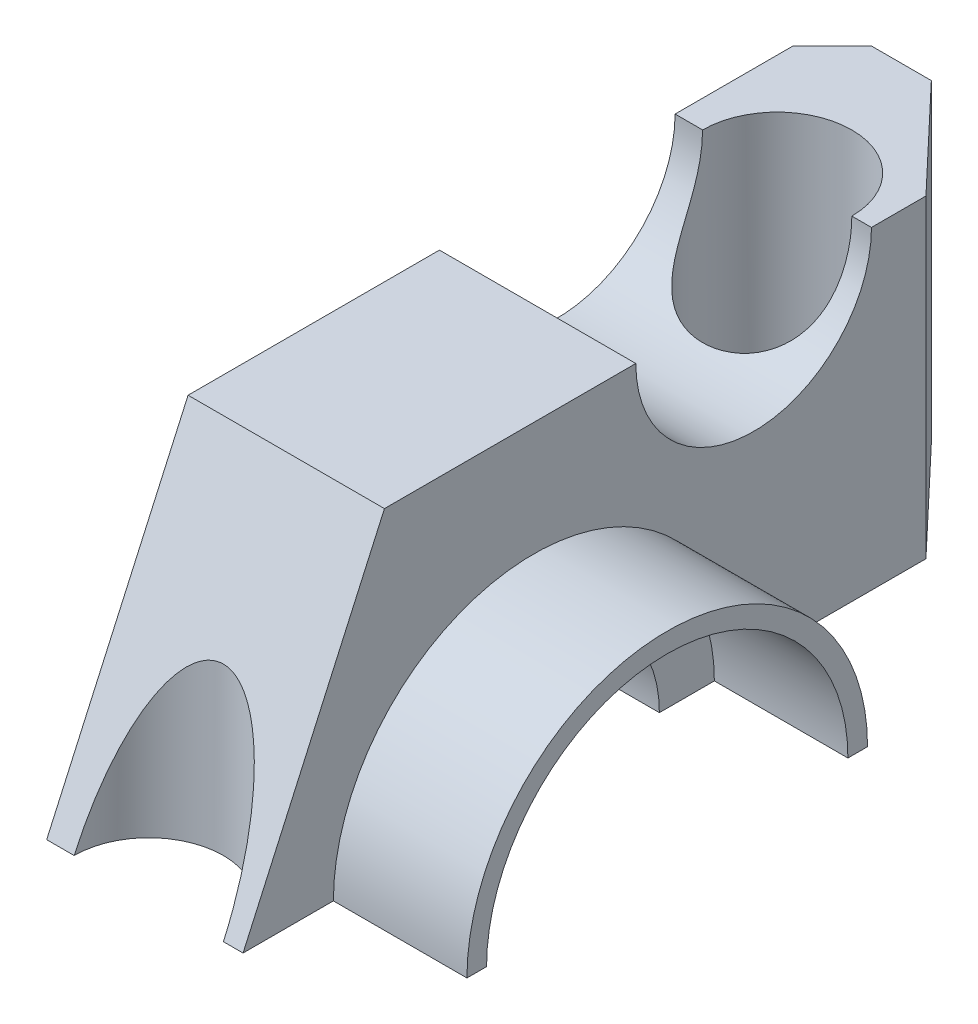
ISO-10303-21;
HEADER;
FILE_DESCRIPTION(('STEP AP214'),'2;1');
FILE_NAME('part.step','',(''),(''),'','','');
FILE_SCHEMA(('AUTOMOTIVE_DESIGN { 1 0 10303 214 1 1 1 1 }'));
ENDSEC;
DATA;
#1=APPLICATION_CONTEXT('core data for automotive mechanical design processes');
#2=APPLICATION_PROTOCOL_DEFINITION('international standard','automotive_design',2000,#1);
#3=PRODUCT_CONTEXT('',#1,'mechanical');
#4=PRODUCT('Part','Part','',(#3));
#5=PRODUCT_RELATED_PRODUCT_CATEGORY('part','',(#4));
#6=PRODUCT_DEFINITION_FORMATION('','',#4);
#7=PRODUCT_DEFINITION_CONTEXT('part definition',#1,'design');
#8=PRODUCT_DEFINITION('design','',#6,#7);
#9=PRODUCT_DEFINITION_SHAPE('','',#8);
#10=(LENGTH_UNIT() NAMED_UNIT(*) SI_UNIT(.MILLI.,.METRE.));
#11=(NAMED_UNIT(*) PLANE_ANGLE_UNIT() SI_UNIT($,.RADIAN.));
#12=(NAMED_UNIT(*) SI_UNIT($,.STERADIAN.) SOLID_ANGLE_UNIT());
#13=UNCERTAINTY_MEASURE_WITH_UNIT(LENGTH_MEASURE(1.E-05),#10,'distance_accuracy_value','');
#14=(GEOMETRIC_REPRESENTATION_CONTEXT(3) GLOBAL_UNCERTAINTY_ASSIGNED_CONTEXT((#13)) GLOBAL_UNIT_ASSIGNED_CONTEXT((#10,
#11,#12)) REPRESENTATION_CONTEXT('',''));
#15=CARTESIAN_POINT('',(0.,0.,0.));
#16=DIRECTION('',(0.,0.,1.));
#17=DIRECTION('',(1.,0.,0.));
#18=AXIS2_PLACEMENT_3D('',#15,#16,#17);
#19=CARTESIAN_POINT('',(25.,0.,0.));
#20=DIRECTION('',(1.,0.,0.));
#21=DIRECTION('',(0.,0.,-1.));
#22=AXIS2_PLACEMENT_3D('',#19,#20,#21);
#23=PLANE('',#22);
#24=CARTESIAN_POINT('',(25.,0.,63.));
#25=DIRECTION('',(1.,0.,0.));
#26=DIRECTION('',(0.,0.,-1.));
#27=AXIS2_PLACEMENT_3D('',#24,#25,#26);
#28=CIRCLE('',#27,25.5);
#29=CARTESIAN_POINT('',(25.,0.,37.5));
#30=VERTEX_POINT('',#29);
#31=CARTESIAN_POINT('',(25.,0.,88.5));
#32=VERTEX_POINT('',#31);
#33=EDGE_CURVE('E170',#30,#32,#28,.T.);
#34=ORIENTED_EDGE('',*,*,#33,.F.);
#35=DIRECTION('',(0.,0.,-1.));
#36=VECTOR('',#35,1.);
#37=CARTESIAN_POINT('',(25.,0.,0.));
#38=LINE('',#37,#36);
#39=CARTESIAN_POINT('',(25.,0.,13.0665833330676));
#40=VERTEX_POINT('',#39);
#41=EDGE_CURVE('E213',#30,#40,#38,.T.);
#42=ORIENTED_EDGE('',*,*,#41,.T.);
#43=DIRECTION('',(0.,1.,0.));
#44=VECTOR('',#43,1.);
#45=CARTESIAN_POINT('',(25.,0.,13.0665833330676));
#46=LINE('',#45,#44);
#47=CARTESIAN_POINT('',(25.,40.,13.0665833330676));
#48=VERTEX_POINT('',#47);
#49=EDGE_CURVE('E311',#40,#48,#46,.T.);
#50=ORIENTED_EDGE('',*,*,#49,.T.);
#51=DIRECTION('',(0.,0.,1.));
#52=VECTOR('',#51,1.);
#53=CARTESIAN_POINT('',(25.,40.,0.));
#54=LINE('',#53,#52);
#55=CARTESIAN_POINT('',(25.,40.,20.));
#56=VERTEX_POINT('',#55);
#57=EDGE_CURVE('E208',#48,#56,#54,.T.);
#58=ORIENTED_EDGE('',*,*,#57,.T.);
#59=CARTESIAN_POINT('',(25.,40.,35.));
#60=DIRECTION('',(1.,0.,0.));
#61=DIRECTION('',(0.,0.,-1.));
#62=AXIS2_PLACEMENT_3D('',#59,#60,#61);
#63=CIRCLE('',#62,15.);
#64=CARTESIAN_POINT('',(25.,40.,50.));
#65=VERTEX_POINT('',#64);
#66=EDGE_CURVE('E189',#56,#65,#63,.F.);
#67=ORIENTED_EDGE('',*,*,#66,.T.);
#68=CARTESIAN_POINT('',(25.,40.,82.));
#69=VERTEX_POINT('',#68);
#70=EDGE_CURVE('E211',#65,#69,#54,.T.);
#71=ORIENTED_EDGE('',*,*,#70,.T.);
#72=DIRECTION('',(0.,-0.911921505175107,0.410364677328798));
#73=VECTOR('',#72,1.);
#74=CARTESIAN_POINT('',(25.,0.,100.));
#75=LINE('',#74,#73);
#76=CARTESIAN_POINT('',(25.,0.,100.));
#77=VERTEX_POINT('',#76);
#78=EDGE_CURVE('E210',#69,#77,#75,.T.);
#79=ORIENTED_EDGE('',*,*,#78,.T.);
#80=EDGE_CURVE('E59',#77,#32,#38,.T.);
#81=ORIENTED_EDGE('',*,*,#80,.T.);
#82=EDGE_LOOP('',(#34,#42,#50,#58,#67,#71,#79,#81));
#83=FACE_BOUND('',#82,.T.);
#84=ADVANCED_FACE('F35',(#83),#23,.T.);
#85=CARTESIAN_POINT('',(25.,0.,63.));
#86=DIRECTION('',(-1.,0.,0.));
#87=DIRECTION('',(0.,0.,-1.));
#88=AXIS2_PLACEMENT_3D('',#85,#86,#87);
#89=CIRCLE('',#88,23.);
#90=CARTESIAN_POINT('',(25.,0.,86.));
#91=VERTEX_POINT('',#90);
#92=CARTESIAN_POINT('',(25.,0.,40.));
#93=VERTEX_POINT('',#92);
#94=EDGE_CURVE('E51',#91,#93,#89,.T.);
#95=ORIENTED_EDGE('',*,*,#94,.F.);
#96=CARTESIAN_POINT('',(25.,0.,79.));
#97=VERTEX_POINT('',#96);
#98=EDGE_CURVE('E216',#91,#97,#38,.T.);
#99=ORIENTED_EDGE('',*,*,#98,.T.);
#100=CARTESIAN_POINT('',(25.,0.,63.));
#101=DIRECTION('',(1.,0.,0.));
#102=DIRECTION('',(0.,0.,-1.));
#103=AXIS2_PLACEMENT_3D('',#100,#101,#102);
#104=CIRCLE('',#103,16.);
#105=CARTESIAN_POINT('',(25.,0.,47.));
#106=VERTEX_POINT('',#105);
#107=EDGE_CURVE('E198',#97,#106,#104,.F.);
#108=ORIENTED_EDGE('',*,*,#107,.T.);
#109=EDGE_CURVE('E217',#106,#93,#38,.T.);
#110=ORIENTED_EDGE('',*,*,#109,.T.);
#111=EDGE_LOOP('',(#95,#99,#108,#110));
#112=FACE_BOUND('',#111,.T.);
#113=ADVANCED_FACE('F279',(#112),#23,.T.);
#114=CARTESIAN_POINT('',(25.,40.,0.));
#115=DIRECTION('',(0.,-1.,0.));
#116=DIRECTION('',(0.,0.,-1.));
#117=AXIS2_PLACEMENT_3D('',#114,#115,#116);
#118=PLANE('',#117);
#119=DIRECTION('',(-1.,0.,0.));
#120=VECTOR('',#119,1.);
#121=CARTESIAN_POINT('',(25.,40.,0.));
#122=LINE('',#121,#120);
#123=CARTESIAN_POINT('',(12.62,40.,0.));
#124=VERTEX_POINT('',#123);
#125=CARTESIAN_POINT('',(4.99999999999999,40.,0.));
#126=VERTEX_POINT('',#125);
#127=EDGE_CURVE('E236',#124,#126,#122,.T.);
#128=ORIENTED_EDGE('',*,*,#127,.T.);
#129=DIRECTION('',(0.707106781186546,0.,-0.70710678118655));
#130=VECTOR('',#129,1.);
#131=CARTESIAN_POINT('',(4.99999999999999,40.,0.));
#132=LINE('',#131,#130);
#133=CARTESIAN_POINT('',(0.,40.,5.00000000000002));
#134=VERTEX_POINT('',#133);
#135=EDGE_CURVE('E310',#126,#134,#132,.F.);
#136=ORIENTED_EDGE('',*,*,#135,.T.);
#137=DIRECTION('',(0.,0.,1.));
#138=VECTOR('',#137,1.);
#139=CARTESIAN_POINT('',(0.,40.,0.));
#140=LINE('',#139,#138);
#141=CARTESIAN_POINT('',(0.,40.,20.));
#142=VERTEX_POINT('',#141);
#143=EDGE_CURVE('E218',#134,#142,#140,.T.);
#144=ORIENTED_EDGE('',*,*,#143,.T.);
#145=DIRECTION('',(-1.,0.,0.));
#146=VECTOR('',#145,1.);
#147=CARTESIAN_POINT('',(119.,40.,20.));
#148=LINE('',#147,#146);
#149=CARTESIAN_POINT('',(3.5,40.,20.));
#150=VERTEX_POINT('',#149);
#151=EDGE_CURVE('E183',#150,#142,#148,.T.);
#152=ORIENTED_EDGE('',*,*,#151,.F.);
#153=CARTESIAN_POINT('',(13.,40.,20.));
#154=DIRECTION('',(0.,-1.,0.));
#155=DIRECTION('',(0.,0.,-1.));
#156=AXIS2_PLACEMENT_3D('',#153,#154,#155);
#157=CIRCLE('',#156,9.5);
#158=CARTESIAN_POINT('',(22.5,40.,20.));
#159=VERTEX_POINT('',#158);
#160=EDGE_CURVE('E202',#159,#150,#157,.F.);
#161=ORIENTED_EDGE('',*,*,#160,.F.);
#162=EDGE_CURVE('E186',#56,#159,#148,.T.);
#163=ORIENTED_EDGE('',*,*,#162,.F.);
#164=ORIENTED_EDGE('',*,*,#57,.F.);
#165=DIRECTION('',(0.687777777777778,0.,0.725921296281533));
#166=VECTOR('',#165,1.);
#167=CARTESIAN_POINT('',(18.4762138024691,40.,6.18099399565619));
#168=LINE('',#167,#166);
#169=EDGE_CURVE('E181',#124,#48,#168,.T.);
#170=ORIENTED_EDGE('',*,*,#169,.F.);
#171=EDGE_LOOP('',(#128,#136,#144,#152,#161,#163,#164,#170));
#172=FACE_BOUND('',#171,.T.);
#173=ADVANCED_FACE('F283',(#172),#118,.F.);
#174=CARTESIAN_POINT('',(25.,0.,0.));
#175=DIRECTION('',(0.,1.,0.));
#176=DIRECTION('',(0.,0.,1.));
#177=AXIS2_PLACEMENT_3D('',#174,#175,#176);
#178=PLANE('',#177);
#179=CARTESIAN_POINT('',(13.,0.,20.));
#180=DIRECTION('',(0.,1.,0.));
#181=DIRECTION('',(0.,0.,1.));
#182=AXIS2_PLACEMENT_3D('',#179,#180,#181);
#183=CIRCLE('',#182,9.5);
#184=CARTESIAN_POINT('',(13.,0.,29.5));
#185=VERTEX_POINT('',#184);
#186=EDGE_CURVE('E201',#185,#185,#183,.F.);
#187=ORIENTED_EDGE('',*,*,#186,.F.);
#188=EDGE_LOOP('',(#187));
#189=FACE_BOUND('',#188,.T.);
#190=DIRECTION('',(0.,0.,-1.));
#191=VECTOR('',#190,1.);
#192=CARTESIAN_POINT('',(0.,0.,0.));
#193=LINE('',#192,#191);
#194=CARTESIAN_POINT('',(0.,0.,47.));
#195=VERTEX_POINT('',#194);
#196=CARTESIAN_POINT('',(0.,0.,5.00000000000002));
#197=VERTEX_POINT('',#196);
#198=EDGE_CURVE('E223',#195,#197,#193,.T.);
#199=ORIENTED_EDGE('',*,*,#198,.T.);
#200=DIRECTION('',(-0.707106781186546,0.,0.70710678118655));
#201=VECTOR('',#200,1.);
#202=CARTESIAN_POINT('',(4.99999999999999,0.,0.));
#203=LINE('',#202,#201);
#204=CARTESIAN_POINT('',(4.99999999999999,0.,0.));
#205=VERTEX_POINT('',#204);
#206=EDGE_CURVE('E11',#197,#205,#203,.F.);
#207=ORIENTED_EDGE('',*,*,#206,.T.);
#208=DIRECTION('',(-1.,0.,0.));
#209=VECTOR('',#208,1.);
#210=CARTESIAN_POINT('',(25.,0.,0.));
#211=LINE('',#210,#209);
#212=CARTESIAN_POINT('',(12.62,0.,0.));
#213=VERTEX_POINT('',#212);
#214=EDGE_CURVE('E215',#213,#205,#211,.T.);
#215=ORIENTED_EDGE('',*,*,#214,.F.);
#216=DIRECTION('',(-0.687777777777778,0.,-0.725921296281533));
#217=VECTOR('',#216,1.);
#218=CARTESIAN_POINT('',(18.4762138024691,0.,6.18099399565619));
#219=LINE('',#218,#217);
#220=EDGE_CURVE('E174',#40,#213,#219,.T.);
#221=ORIENTED_EDGE('',*,*,#220,.F.);
#222=ORIENTED_EDGE('',*,*,#41,.F.);
#223=DIRECTION('',(-1.,0.,0.));
#224=VECTOR('',#223,1.);
#225=CARTESIAN_POINT('',(42.,0.,37.5));
#226=LINE('',#225,#224);
#227=CARTESIAN_POINT('',(42.,0.,37.5));
#228=VERTEX_POINT('',#227);
#229=EDGE_CURVE('E464',#228,#30,#226,.T.);
#230=ORIENTED_EDGE('',*,*,#229,.F.);
#231=DIRECTION('',(0.,0.,-1.));
#232=VECTOR('',#231,1.);
#233=CARTESIAN_POINT('',(42.,0.,40.));
#234=LINE('',#233,#232);
#235=CARTESIAN_POINT('',(42.,0.,40.));
#236=VERTEX_POINT('',#235);
#237=EDGE_CURVE('E164',#236,#228,#234,.T.);
#238=ORIENTED_EDGE('',*,*,#237,.F.);
#239=DIRECTION('',(-1.,0.,0.));
#240=VECTOR('',#239,1.);
#241=CARTESIAN_POINT('',(42.,0.,40.));
#242=LINE('',#241,#240);
#243=EDGE_CURVE('E176',#236,#93,#242,.T.);
#244=ORIENTED_EDGE('',*,*,#243,.T.);
#245=ORIENTED_EDGE('',*,*,#109,.F.);
#246=DIRECTION('',(-1.,0.,0.));
#247=VECTOR('',#246,1.);
#248=CARTESIAN_POINT('',(119.,0.,47.));
#249=LINE('',#248,#247);
#250=EDGE_CURVE('E196',#195,#106,#249,.F.);
#251=ORIENTED_EDGE('',*,*,#250,.F.);
#252=EDGE_LOOP('',(#199,#207,#215,#221,#222,#230,#238,#244,#245,#251));
#253=FACE_BOUND('',#252,.T.);
#254=ADVANCED_FACE('F285',(#189,#253),#178,.F.);
#255=CARTESIAN_POINT('',(25.,0.,0.));
#256=DIRECTION('',(0.,0.,1.));
#257=DIRECTION('',(1.,0.,0.));
#258=AXIS2_PLACEMENT_3D('',#255,#256,#257);
#259=PLANE('',#258);
#260=ORIENTED_EDGE('',*,*,#214,.T.);
#261=DIRECTION('',(0.,1.,0.));
#262=VECTOR('',#261,1.);
#263=CARTESIAN_POINT('',(4.99999999999999,0.,0.));
#264=LINE('',#263,#262);
#265=EDGE_CURVE('E304',#205,#126,#264,.T.);
#266=ORIENTED_EDGE('',*,*,#265,.T.);
#267=ORIENTED_EDGE('',*,*,#127,.F.);
#268=DIRECTION('',(0.,-1.,0.));
#269=VECTOR('',#268,1.);
#270=CARTESIAN_POINT('',(12.62,134.,0.));
#271=LINE('',#270,#269);
#272=EDGE_CURVE('E171',#124,#213,#271,.T.);
#273=ORIENTED_EDGE('',*,*,#272,.T.);
#274=EDGE_LOOP('',(#260,#266,#267,#273));
#275=FACE_BOUND('',#274,.T.);
#276=ADVANCED_FACE('F288',(#275),#259,.F.);
#277=DIRECTION('',(-1.,0.,0.));
#278=VECTOR('',#277,1.);
#279=CARTESIAN_POINT('',(119.,40.,50.));
#280=LINE('',#279,#278);
#281=CARTESIAN_POINT('',(0.,40.,50.));
#282=VERTEX_POINT('',#281);
#283=EDGE_CURVE('E192',#282,#65,#280,.F.);
#284=ORIENTED_EDGE('',*,*,#283,.F.);
#285=CARTESIAN_POINT('',(0.,40.,82.));
#286=VERTEX_POINT('',#285);
#287=EDGE_CURVE('E207',#282,#286,#140,.T.);
#288=ORIENTED_EDGE('',*,*,#287,.T.);
#289=DIRECTION('',(-1.,0.,0.));
#290=VECTOR('',#289,1.);
#291=CARTESIAN_POINT('',(25.,40.,82.));
#292=LINE('',#291,#290);
#293=EDGE_CURVE('E233',#69,#286,#292,.T.);
#294=ORIENTED_EDGE('',*,*,#293,.F.);
#295=ORIENTED_EDGE('',*,*,#70,.F.);
#296=EDGE_LOOP('',(#284,#288,#294,#295));
#297=FACE_BOUND('',#296,.T.);
#298=ADVANCED_FACE('F293',(#297),#118,.F.);
#299=DIRECTION('',(-1.,0.,0.));
#300=VECTOR('',#299,1.);
#301=CARTESIAN_POINT('',(119.,0.,79.));
#302=LINE('',#301,#300);
#303=CARTESIAN_POINT('',(0.,0.,79.));
#304=VERTEX_POINT('',#303);
#305=EDGE_CURVE('E194',#97,#304,#302,.T.);
#306=ORIENTED_EDGE('',*,*,#305,.F.);
#307=ORIENTED_EDGE('',*,*,#98,.F.);
#308=DIRECTION('',(-1.,0.,0.));
#309=VECTOR('',#308,1.);
#310=CARTESIAN_POINT('',(42.,0.,86.));
#311=LINE('',#310,#309);
#312=CARTESIAN_POINT('',(42.,0.,86.));
#313=VERTEX_POINT('',#312);
#314=EDGE_CURVE('E155',#313,#91,#311,.T.);
#315=ORIENTED_EDGE('',*,*,#314,.F.);
#316=DIRECTION('',(0.,0.,-1.));
#317=VECTOR('',#316,1.);
#318=CARTESIAN_POINT('',(42.,0.,88.5));
#319=LINE('',#318,#317);
#320=CARTESIAN_POINT('',(42.,0.,88.5));
#321=VERTEX_POINT('',#320);
#322=EDGE_CURVE('E147',#321,#313,#319,.T.);
#323=ORIENTED_EDGE('',*,*,#322,.F.);
#324=DIRECTION('',(-1.,0.,0.));
#325=VECTOR('',#324,1.);
#326=CARTESIAN_POINT('',(42.,0.,88.5));
#327=LINE('',#326,#325);
#328=EDGE_CURVE('E152',#321,#32,#327,.T.);
#329=ORIENTED_EDGE('',*,*,#328,.T.);
#330=ORIENTED_EDGE('',*,*,#80,.F.);
#331=DIRECTION('',(-1.,0.,0.));
#332=VECTOR('',#331,1.);
#333=CARTESIAN_POINT('',(25.,0.,100.));
#334=LINE('',#333,#332);
#335=CARTESIAN_POINT('',(22.5,0.,100.));
#336=VERTEX_POINT('',#335);
#337=EDGE_CURVE('E230',#77,#336,#334,.T.);
#338=ORIENTED_EDGE('',*,*,#337,.T.);
#339=CARTESIAN_POINT('',(13.,0.,100.));
#340=DIRECTION('',(0.,1.,0.));
#341=DIRECTION('',(0.,0.,1.));
#342=AXIS2_PLACEMENT_3D('',#339,#340,#341);
#343=CIRCLE('',#342,9.5);
#344=CARTESIAN_POINT('',(3.5,0.,100.));
#345=VERTEX_POINT('',#344);
#346=EDGE_CURVE('E239',#345,#336,#343,.F.);
#347=ORIENTED_EDGE('',*,*,#346,.F.);
#348=CARTESIAN_POINT('',(0.,0.,100.));
#349=VERTEX_POINT('',#348);
#350=EDGE_CURVE('E229',#345,#349,#334,.T.);
#351=ORIENTED_EDGE('',*,*,#350,.T.);
#352=EDGE_CURVE('E224',#349,#304,#193,.T.);
#353=ORIENTED_EDGE('',*,*,#352,.T.);
#354=EDGE_LOOP('',(#306,#307,#315,#323,#329,#330,#338,#347,#351,#353));
#355=FACE_BOUND('',#354,.T.);
#356=ADVANCED_FACE('F150',(#355),#178,.F.);
#357=CARTESIAN_POINT('',(13.,94.,20.));
#358=DIRECTION('',(0.,-1.,0.));
#359=DIRECTION('',(0.,0.,-1.));
#360=AXIS2_PLACEMENT_3D('',#357,#358,#359);
#361=CYLINDRICAL_SURFACE('',#360,9.5);
#362=ORIENTED_EDGE('',*,*,#186,.T.);
#363=EDGE_LOOP('',(#362));
#364=FACE_BOUND('',#363,.T.);
#365=ORIENTED_EDGE('',*,*,#160,.T.);
#366=CARTESIAN_POINT('',(13.,53.9552857369529,29.5));
#367=CARTESIAN_POINT('',(12.7544762232247,53.95528567975,29.5000001159096));
#368=CARTESIAN_POINT('',(12.5089543531506,53.9515427009707,29.4904742032778));
#369=CARTESIAN_POINT('',(12.0196173105251,53.936472271403,29.4524637592219));
#370=CARTESIAN_POINT('',(11.7758021196832,53.9251449020221,29.4239794312895));
#371=CARTESIAN_POINT('',(11.2915975344414,53.8946163536027,29.3483367607816));
#372=CARTESIAN_POINT('',(11.0512079456139,53.8754156232905,29.3011794824388));
#373=CARTESIAN_POINT('',(10.5755470081886,53.828673529006,29.1886752429484));
#374=CARTESIAN_POINT('',(10.3402756613942,53.8011321620949,29.1233282753918));
#375=CARTESIAN_POINT('',(9.8763017252885,53.7370572887173,28.9750700774387));
#376=CARTESIAN_POINT('',(9.64760650230346,53.7005141058336,28.8921399596505));
#377=CARTESIAN_POINT('',(9.19873533113651,53.6177199658218,28.7097115008079));
#378=CARTESIAN_POINT('',(8.97855936427316,53.5714690299828,28.6102131960875));
#379=CARTESIAN_POINT('',(8.54841982670951,53.4684816068328,28.3959009507662));
#380=CARTESIAN_POINT('',(8.33845349823546,53.4117479711515,28.2810911777319));
#381=CARTESIAN_POINT('',(7.93021367314039,53.2869978683727,28.0376453352084));
#382=CARTESIAN_POINT('',(7.73193992279337,53.2189816462267,27.9090095659108));
#383=CARTESIAN_POINT('',(7.35182893377078,53.0722441911343,27.6420648125941));
#384=CARTESIAN_POINT('',(7.16976486612344,52.993731003731,27.5039643722569));
#385=CARTESIAN_POINT('',(6.81937909309046,52.8245734856211,27.2181053588617));
#386=CARTESIAN_POINT('',(6.65105711584402,52.7339293949948,27.0703469769716));
#387=CARTESIAN_POINT('',(6.3290347930594,52.5401703805338,26.7673549023128));
#388=CARTESIAN_POINT('',(6.1753313606361,52.4370581000025,26.6121227981866));
#389=CARTESIAN_POINT('',(5.88303101018962,52.2182139326865,26.296430188818));
#390=CARTESIAN_POINT('',(5.74443420077588,52.1024819551841,26.1359696459964));
#391=CARTESIAN_POINT('',(5.4834053722043,51.8593307166882,25.813226066654));
#392=CARTESIAN_POINT('',(5.36087070453915,51.7319954797976,25.6509626013891));
#393=CARTESIAN_POINT('',(5.13070179106238,51.4653174729815,25.3257708081329));
#394=CARTESIAN_POINT('',(5.02306713106096,51.3259750370065,25.1628424987526));
#395=CARTESIAN_POINT('',(4.82216645859129,51.0357565667013,24.8383335437489));
#396=CARTESIAN_POINT('',(4.7289042816344,50.8848774696579,24.6767532687124));
#397=CARTESIAN_POINT('',(4.55599615368567,50.5722647312071,24.3568200308019));
#398=CARTESIAN_POINT('',(4.47635282307329,50.4105290092125,24.198467694161));
#399=CARTESIAN_POINT('',(4.30484313395299,50.0203692977089,23.8337300370676));
#400=CARTESIAN_POINT('',(4.21798998793243,49.7879290628641,23.6292654067313));
#401=CARTESIAN_POINT('',(4.06423203351489,49.3068440905852,23.232246348133));
#402=CARTESIAN_POINT('',(3.99733280177131,49.0581948467266,23.0396952613227));
#403=CARTESIAN_POINT('',(3.88044399705698,48.5462008437736,22.6686343006258));
#404=CARTESIAN_POINT('',(3.83048418980861,48.2828311540641,22.4901495618905));
#405=CARTESIAN_POINT('',(3.7446813793124,47.7436425691044,22.1494060412717));
#406=CARTESIAN_POINT('',(3.70883893737199,47.467823179339,21.9871479047503));
#407=CARTESIAN_POINT('',(3.64093937432997,46.8354921190649,21.6420067680682));
#408=CARTESIAN_POINT('',(3.6120366399764,46.4759618849034,21.4640193588046));
#409=CARTESIAN_POINT('',(3.56686445772863,45.7431093843311,21.1371796206339));
#410=CARTESIAN_POINT('',(3.55059792808831,45.3697839528454,20.9883340277831));
#411=CARTESIAN_POINT('',(3.5264485858486,44.6121177111132,20.7210025089884));
#412=CARTESIAN_POINT('',(3.51856685930389,44.227775480518,20.6025205174456));
#413=CARTESIAN_POINT('',(3.50773122543267,43.4507933510421,20.3967970647618));
#414=CARTESIAN_POINT('',(3.50477699495322,43.05815399801,20.3095535552467));
#415=CARTESIAN_POINT('',(3.50118251360024,42.2638896166345,20.1662891739972));
#416=CARTESIAN_POINT('',(3.5005614070652,41.8622173380731,20.1105297941903));
#417=CARTESIAN_POINT('',(3.49997101777366,41.0556746604999,20.0317089654767));
#418=CARTESIAN_POINT('',(3.5000017414833,40.6508042298024,20.0086478409391));
#419=CARTESIAN_POINT('',(3.4999986843773,39.8404741901389,19.9953750035187));
#420=CARTESIAN_POINT('',(3.49996489564805,39.4350145149881,20.0051673208089));
#421=CARTESIAN_POINT('',(3.50013860086939,38.6262183003455,20.0575451967918));
#422=CARTESIAN_POINT('',(3.50034609759639,38.2228817853381,20.1001311328295));
#423=CARTESIAN_POINT('',(3.50235492697916,37.404476864765,20.2202414363308));
#424=CARTESIAN_POINT('',(3.50422145922097,36.9896081889934,20.2991307027137));
#425=CARTESIAN_POINT('',(3.51223976436726,36.1679796082734,20.4916003018391));
#426=CARTESIAN_POINT('',(3.51839204025118,35.7612206608555,20.6051847055611));
#427=CARTESIAN_POINT('',(3.53866207670336,34.9589743464815,20.8661416606338));
#428=CARTESIAN_POINT('',(3.55277809630589,34.5634845358073,21.0135068229444));
#429=CARTESIAN_POINT('',(3.59364289948069,33.7869112451927,21.340757129459));
#430=CARTESIAN_POINT('',(3.62038806195786,33.4058236695726,21.5206329429168));
#431=CARTESIAN_POINT('',(3.68372075816207,32.7482004500904,21.8654892489887));
#432=CARTESIAN_POINT('',(3.71656396586046,32.4679900753624,22.0241778993682));
#433=CARTESIAN_POINT('',(3.79577406736766,31.9197077646605,22.3583276627472));
#434=CARTESIAN_POINT('',(3.84213992173473,31.651634897545,22.5337874859045));
#435=CARTESIAN_POINT('',(3.95128439089755,31.1298696238912,22.8994989833533));
#436=CARTESIAN_POINT('',(4.01403728839333,30.8761554357602,23.0897271548412));
#437=CARTESIAN_POINT('',(4.15900303268182,30.3846212591749,23.4829061567093));
#438=CARTESIAN_POINT('',(4.2412119743986,30.1467980934574,23.6858544280018));
#439=CARTESIAN_POINT('',(4.41028864175664,29.7322763175765,24.0621403831157));
#440=CARTESIAN_POINT('',(4.49334170551876,29.5525184887599,24.2338281606583));
#441=CARTESIAN_POINT('',(4.67545872723895,29.2057446087235,24.581540302022));
#442=CARTESIAN_POINT('',(4.77452087711453,29.0387271217285,24.7575641742195));
#443=CARTESIAN_POINT('',(4.98968773634899,28.7183695280708,25.111532950933));
#444=CARTESIAN_POINT('',(5.10578656150011,28.5650247283503,25.2894771726089));
#445=CARTESIAN_POINT('',(5.35574142593015,28.2726394229458,25.6446843188198));
#446=CARTESIAN_POINT('',(5.48959767681972,28.1335990877594,25.82194723521));
#447=CARTESIAN_POINT('',(5.77603211896178,27.8695790319173,26.173816013272));
#448=CARTESIAN_POINT('',(5.928702850043,27.7446751182474,26.3484035743519));
#449=CARTESIAN_POINT('',(6.25195204109385,27.50986630057,26.690986778138));
#450=CARTESIAN_POINT('',(6.42253076890425,27.3999616209549,26.8589823221992));
#451=CARTESIAN_POINT('',(6.78083845845932,27.1949199244952,27.18545575374));
#452=CARTESIAN_POINT('',(6.96856839961655,27.099783751838,27.3439330968294));
#453=CARTESIAN_POINT('',(7.35996511310903,26.9237507580532,27.6486273929082));
#454=CARTESIAN_POINT('',(7.56363091004376,26.8428530664011,27.7948450951517));
#455=CARTESIAN_POINT('',(7.96705479692448,26.7009439964987,28.0605619543352));
#456=CARTESIAN_POINT('',(8.16562190020769,26.6388167883255,28.1812784566682));
#457=CARTESIAN_POINT('',(8.57338359363878,26.5250759405395,28.4088987804165));
#458=CARTESIAN_POINT('',(8.78257750059059,26.4734616261199,28.5158034882288));
#459=CARTESIAN_POINT('',(9.21012391082265,26.3799969562568,28.714494515969));
#460=CARTESIAN_POINT('',(9.42847659098073,26.3381467894848,28.8062805437502));
#461=CARTESIAN_POINT('',(9.87279526837883,26.2634834382253,28.9736812474903));
#462=CARTESIAN_POINT('',(10.0987614624545,26.2306704875826,29.0492955049812));
#463=CARTESIAN_POINT('',(10.5579208006952,26.1732788065761,29.18388735359));
#464=CARTESIAN_POINT('',(10.7911456507681,26.1487441972223,29.2427755446138));
#465=CARTESIAN_POINT('',(11.2620582133943,26.1076004571835,29.3427779919946));
#466=CARTESIAN_POINT('',(11.4997459148213,26.0909913067421,29.3838922926578));
#467=CARTESIAN_POINT('',(11.9779842014843,26.065298869606,29.4479465616878));
#468=CARTESIAN_POINT('',(12.2185350857804,26.0562163761949,29.4708846143296));
#469=CARTESIAN_POINT('',(12.7008513300055,26.0453525776541,29.4983608709738));
#470=CARTESIAN_POINT('',(12.9426167108164,26.0435713984951,29.5028987575152));
#471=CARTESIAN_POINT('',(13.4315751483186,26.0473094028597,29.4934170520615));
#472=CARTESIAN_POINT('',(13.6787582512966,26.0530059633247,29.4789465630198));
#473=CARTESIAN_POINT('',(14.1709480930467,26.0721609330156,29.4308018869129));
#474=CARTESIAN_POINT('',(14.415954794774,26.0856194741028,29.3971273736079));
#475=CARTESIAN_POINT('',(14.9020526150997,26.1206459916045,29.3109143954479));
#476=CARTESIAN_POINT('',(15.1431435585963,26.1422143296305,29.2583750894267));
#477=CARTESIAN_POINT('',(15.6196485422926,26.1939829093303,29.1349881539766));
#478=CARTESIAN_POINT('',(15.8550626323406,26.2241830751781,29.0641406853757));
#479=CARTESIAN_POINT('',(16.3182786799329,26.2938534373955,28.9049955513019));
#480=CARTESIAN_POINT('',(16.5460870119637,26.3333156364027,28.8167129506756));
#481=CARTESIAN_POINT('',(16.9925992145774,26.4222918843069,28.6237059083364));
#482=CARTESIAN_POINT('',(17.211303096301,26.4718059209036,28.5189814867435));
#483=CARTESIAN_POINT('',(17.6378923422065,26.5816800905875,28.2944577836535));
#484=CARTESIAN_POINT('',(17.8457812972733,26.6420365936204,28.1746635515354));
#485=CARTESIAN_POINT('',(18.2492848538121,26.7743959226664,27.9215981077928));
#486=CARTESIAN_POINT('',(18.4448998002856,26.8463984211269,27.7883272752477));
#487=CARTESIAN_POINT('',(18.8177212769457,27.0007638056522,27.5137445268015));
#488=CARTESIAN_POINT('',(18.9952683947441,27.0828183774502,27.3727214700649));
#489=CARTESIAN_POINT('',(19.3363842574314,27.2591412795903,27.0817014816349));
#490=CARTESIAN_POINT('',(19.4999533572667,27.3534092996411,26.9317047779756));
#491=CARTESIAN_POINT('',(19.812333135589,27.5544292311561,26.624955147402));
#492=CARTESIAN_POINT('',(19.9611469973513,27.6611784390686,26.4682036882641));
#493=CARTESIAN_POINT('',(20.2436404450633,27.8872372610742,26.1501961198563));
#494=CARTESIAN_POINT('',(20.3773198410463,28.0065470327904,25.9889399540753));
#495=CARTESIAN_POINT('',(20.6292232459533,28.2572925342855,25.664542989636));
#496=CARTESIAN_POINT('',(20.7474779596214,28.3887032571605,25.5014066610833));
#497=CARTESIAN_POINT('',(20.9691292625767,28.6634549475144,25.1751216803884));
#498=CARTESIAN_POINT('',(21.0725261994122,28.8067956358075,25.0119730286239));
#499=CARTESIAN_POINT('',(21.2651014350615,29.1049021058002,24.6876106371166));
#500=CARTESIAN_POINT('',(21.3542738432567,29.2596725821551,24.5263977244197));
#501=CARTESIAN_POINT('',(21.5192145304541,29.5799007297423,24.207753070973));
#502=CARTESIAN_POINT('',(21.5949801774361,29.7453604908143,24.0503220779223));
#503=CARTESIAN_POINT('',(21.759089387291,30.1473129771475,23.685307876153));
#504=CARTESIAN_POINT('',(21.8422044841195,30.3880056709581,23.4799785999648));
#505=CARTESIAN_POINT('',(21.9885513788597,30.885662086084,23.0823491438387));
#506=CARTESIAN_POINT('',(22.051776887438,31.1426309233207,22.89005310022));
#507=CARTESIAN_POINT('',(22.1615226672424,31.671138255338,22.5206510506982));
#508=CARTESIAN_POINT('',(22.2080207750847,31.942695536223,22.3435654328473));
#509=CARTESIAN_POINT('',(22.2872718426059,32.4981516954281,22.0066243314345));
#510=CARTESIAN_POINT('',(22.3200255588342,32.7820498935024,21.8467678998654));
#511=CARTESIAN_POINT('',(22.3751729081611,33.3655853650899,21.5428577183858));
#512=CARTESIAN_POINT('',(22.3973727952089,33.6654123326455,21.3991339644833));
#513=CARTESIAN_POINT('',(22.4333068747102,34.2743608835453,21.131775589651));
#514=CARTESIAN_POINT('',(22.4470410581143,34.5834824768245,21.0081409901956));
#515=CARTESIAN_POINT('',(22.4684695653989,35.2093739794015,20.7816796292658));
#516=CARTESIAN_POINT('',(22.4761652044261,35.5261422078235,20.6788483406189));
#517=CARTESIAN_POINT('',(22.4875720415375,36.1658935041559,20.4944673305582));
#518=CARTESIAN_POINT('',(22.4912828880929,36.488877117815,20.4129194871995));
#519=CARTESIAN_POINT('',(22.496935382344,37.2096160579926,20.2562754134674));
#520=CARTESIAN_POINT('',(22.4983246337649,37.6085081461204,20.1863418093685));
#521=CARTESIAN_POINT('',(22.4998232196233,38.410669118019,20.0789469871521));
#522=CARTESIAN_POINT('',(22.4999324045671,38.8139385074923,20.0414895622667));
#523=CARTESIAN_POINT('',(22.5000238416138,39.6224514516043,19.9992860871125));
#524=CARTESIAN_POINT('',(22.5000060120929,40.0276961084527,19.9945610756779));
#525=CARTESIAN_POINT('',(22.4999898953078,40.8372272478045,20.0179097232105));
#526=CARTESIAN_POINT('',(22.4999916077203,41.2415137460491,20.0459828395532));
#527=CARTESIAN_POINT('',(22.4991313809981,42.0631643624596,20.1365829579804));
#528=CARTESIAN_POINT('',(22.4982336945053,42.4803772170143,20.2004878348358));
#529=CARTESIAN_POINT('',(22.4934020613613,43.3079691584046,20.3632242497421));
#530=CARTESIAN_POINT('',(22.4894677753716,43.7183474762479,20.4620596905969));
#531=CARTESIAN_POINT('',(22.4753349016961,44.5291827112235,20.6939072034851));
#532=CARTESIAN_POINT('',(22.4651370442476,44.9296407792452,20.8269152904558));
#533=CARTESIAN_POINT('',(22.4342283907079,45.7175462189215,21.1260276611736));
#534=CARTESIAN_POINT('',(22.413520103364,46.1049966718617,21.292124041291));
#535=CARTESIAN_POINT('',(22.3622814242374,46.7854636794863,21.6183299062162));
#536=CARTESIAN_POINT('',(22.3346520889383,47.0814955834033,21.7726278788739));
#537=CARTESIAN_POINT('',(22.266511518604,47.661530620456,22.099931022559));
#538=CARTESIAN_POINT('',(22.226001034131,47.9455344533541,22.2729351032266));
#539=CARTESIAN_POINT('',(22.12896047443,48.4991282861216,22.6357702381109));
#540=CARTESIAN_POINT('',(22.0724551548369,48.7687398008528,22.8255749799001));
#541=CARTESIAN_POINT('',(21.9400628394136,49.2918911020499,23.2200180888032));
#542=CARTESIAN_POINT('',(21.8641801622419,49.5454344539542,23.4246531433959));
#543=CARTESIAN_POINT('',(21.7074194581071,49.984821157917,23.8031414912044));
#544=CARTESIAN_POINT('',(21.6306552547285,50.1739860888323,23.9748504729188));
#545=CARTESIAN_POINT('',(21.4612013694686,50.5396234162372,24.3238504581183));
#546=CARTESIAN_POINT('',(21.3685135568598,50.7160972990835,24.5011408044139));
#547=CARTESIAN_POINT('',(21.1659710594028,51.0552849933737,24.8589242857324));
#548=CARTESIAN_POINT('',(21.0561234682054,51.2180044480907,25.039416070109));
#549=CARTESIAN_POINT('',(20.818307460903,51.5289286817765,25.4010074214993));
#550=CARTESIAN_POINT('',(20.690338849341,51.6771333041565,25.5821069950481));
#551=CARTESIAN_POINT('',(20.414986812999,51.9592794706334,25.9430454251978));
#552=CARTESIAN_POINT('',(20.2674915951221,52.0931301806617,26.1228702149838));
#553=CARTESIAN_POINT('',(19.9537337818355,52.3452721850883,26.4770007677432));
#554=CARTESIAN_POINT('',(19.7874709146307,52.4635632540965,26.6513064507414));
#555=CARTESIAN_POINT('',(19.4367855815295,52.6846707429793,26.9912387708858));
#556=CARTESIAN_POINT('',(19.2523639965682,52.7874879129288,27.1568658284619));
#557=CARTESIAN_POINT('',(18.8664551842153,52.9780961407929,27.4764598928824));
#558=CARTESIAN_POINT('',(18.6649692263916,53.0658883150827,27.6304277655438));
#559=CARTESIAN_POINT('',(18.2672022518721,53.2191942593901,27.9094648482423));
#560=CARTESIAN_POINT('',(18.072383631086,53.286053551765,28.0358858520933));
#561=CARTESIAN_POINT('',(17.6714548795767,53.40886618701,28.2753866635483));
#562=CARTESIAN_POINT('',(17.4653456412115,53.4648203901792,28.3884675232741));
#563=CARTESIAN_POINT('',(17.0432604793448,53.5665807447444,28.5998702967583));
#564=CARTESIAN_POINT('',(16.827283312773,53.6123856133463,28.698190344363));
#565=CARTESIAN_POINT('',(16.3870251831931,53.6945927415488,28.8788899855886));
#566=CARTESIAN_POINT('',(16.1627438350366,53.7309945644097,28.9612688387501));
#567=CARTESIAN_POINT('',(15.7000626524973,53.7961351762887,29.1115715769876));
#568=CARTESIAN_POINT('',(15.4614408916426,53.8245858909709,29.1789375245733));
#569=CARTESIAN_POINT('',(14.9788308549341,53.8728580050965,29.2949355619474));
#570=CARTESIAN_POINT('',(14.7348424407094,53.8926791817662,29.3435671681002));
#571=CARTESIAN_POINT('',(14.2432699936137,53.9241887327305,29.4215826135891));
#572=CARTESIAN_POINT('',(13.9956856528504,53.9358764063737,29.4509647946921));
#573=CARTESIAN_POINT('',(13.4987335334169,53.9514248750448,29.4901732729037));
#574=CARTESIAN_POINT('',(13.249365783288,53.9552857950508,29.4999998822766));
#575=CARTESIAN_POINT('',(13.,53.9552857369529,29.5));
#576=B_SPLINE_CURVE_WITH_KNOTS('',3,(#366,#367,#368,#369,#370,#371,#372,#373,#374,#375,#376,
#377,#378,#379,#380,#381,#382,#383,#384,#385,#386,#387,#388,#389,#390,#391,#392,#393,#394,#395,
#396,#397,#398,#399,#400,#401,#402,#403,#404,#405,#406,#407,#408,#409,#410,#411,#412,#413,#414,
#415,#416,#417,#418,#419,#420,#421,#422,#423,#424,#425,#426,#427,#428,#429,#430,#431,#432,#433,
#434,#435,#436,#437,#438,#439,#440,#441,#442,#443,#444,#445,#446,#447,#448,#449,#450,#451,#452,
#453,#454,#455,#456,#457,#458,#459,#460,#461,#462,#463,#464,#465,#466,#467,#468,#469,#470,#471,
#472,#473,#474,#475,#476,#477,#478,#479,#480,#481,#482,#483,#484,#485,#486,#487,#488,#489,#490,
#491,#492,#493,#494,#495,#496,#497,#498,#499,#500,#501,#502,#503,#504,#505,#506,#507,#508,#509,
#510,#511,#512,#513,#514,#515,#516,#517,#518,#519,#520,#521,#522,#523,#524,#525,#526,#527,#528,
#529,#530,#531,#532,#533,#534,#535,#536,#537,#538,#539,#540,#541,#542,#543,#544,#545,#546,#547,
#548,#549,#550,#551,#552,#553,#554,#555,#556,#557,#558,#559,#560,#561,#562,#563,#564,#565,#566,
#567,#568,#569,#570,#571,#572,#573,#574,#575),.UNSPECIFIED.,.T.,.F.,(4,2,2,2,2,2,2,2,2,2,2,2,2,
2,2,2,2,2,2,2,2,2,2,2,2,2,2,2,2,2,2,2,2,2,2,2,2,2,2,2,2,2,2,2,2,2,2,2,2,2,2,2,2,2,2,2,2,2,2,2,2,
2,2,2,2,2,2,2,2,2,2,2,2,2,2,2,2,2,2,2,2,2,2,2,2,2,2,2,2,2,2,2,2,2,2,2,2,2,2,2,2,2,2,2,4),(0.,
0.736354869630782,1.47270183566463,2.20900684091326,2.94531210559507,3.68241233521639,
4.41951094839701,5.1564093415971,5.89329173839919,6.61728557013983,7.34126507558425,
8.06509136286318,8.78892285376597,9.50787602716514,10.2268092111181,10.9459339221081,
11.6651968433705,12.6283609509635,13.591793988767,14.5569112889258,15.5220669583431,
16.7270809292935,17.9323731081546,19.1378213853625,20.3431906042666,21.5584290863068,
22.7736796235179,23.989079242487,25.2044928468554,26.4698934309882,27.7354425489063,
29.0007151104174,30.2656251063229,31.2358629408981,32.2060262161028,33.1746760039172,
34.1431315360185,34.9286149461061,35.7140097048168,36.4991338358537,37.284267323852,
38.0734294045414,38.862603290007,39.6518222691043,40.4409929794836,41.1617714547147,
41.8825036496757,42.6032497701135,43.3240145386503,44.0485622254979,44.773108106206,
45.4977303418448,46.2223650794528,46.9645031167141,47.7066537618626,48.4488375030367,
49.191014724724,49.9325534510581,50.674091269981,51.4153812834083,52.1566504510996,
52.8791597720487,53.6016507407313,54.3239854994818,55.0463293239212,55.7672125450515,
56.4880789007728,57.2092430088102,57.9305485393402,58.9104434410907,59.8906478869691,
60.8721463367054,61.8535907535314,62.852416207556,63.8512427292664,64.8498516540951,
65.8485486665897,67.0621093553324,68.2758117694129,69.4902942212018,70.704756580417,
71.9694825656059,73.2343499037603,74.4990698055868,75.7634879717513,76.767509983381,
77.7714735031121,78.773891578801,79.7760864388716,80.5756006306571,81.3750210315181,
82.1741118316642,82.9732112516169,83.777101294343,84.581002980583,85.3848656862859,
86.1886686380671,86.9128274418815,87.6369290938921,88.3611222143856,89.0853489651658,
89.8331546933016,90.580979725095,91.3288691694732,92.0767466714206),.UNSPECIFIED.);
#577=EDGE_CURVE('E243',#150,#159,#576,.T.);
#578=ORIENTED_EDGE('',*,*,#577,.T.);
#579=EDGE_LOOP('',(#365,#578));
#580=FACE_BOUND('',#579,.T.);
#581=ADVANCED_FACE('F253',(#364,#580),#361,.F.);
#582=CARTESIAN_POINT('',(25.,0.,100.));
#583=DIRECTION('',(0.,-0.410364677328798,-0.911921505175106));
#584=DIRECTION('',(0.,0.911921505175107,-0.410364677328798));
#585=AXIS2_PLACEMENT_3D('',#582,#583,#584);
#586=PLANE('',#585);
#587=CARTESIAN_POINT('',(13.,0.,100.));
#588=DIRECTION('',(0.,-0.410364677328798,-0.911921505175106));
#589=DIRECTION('',(0.,-0.911921505175107,0.410364677328798));
#590=AXIS2_PLACEMENT_3D('',#587,#588,#589);
#591=ELLIPSE('',#590,23.1501406549869,9.5);
#592=EDGE_CURVE('E205',#336,#345,#591,.F.);
#593=ORIENTED_EDGE('',*,*,#592,.F.);
#594=ORIENTED_EDGE('',*,*,#337,.F.);
#595=ORIENTED_EDGE('',*,*,#78,.F.);
#596=ORIENTED_EDGE('',*,*,#293,.T.);
#597=DIRECTION('',(0.,-0.911921505175107,0.410364677328798));
#598=VECTOR('',#597,1.);
#599=CARTESIAN_POINT('',(0.,0.,100.));
#600=LINE('',#599,#598);
#601=EDGE_CURVE('E220',#286,#349,#600,.T.);
#602=ORIENTED_EDGE('',*,*,#601,.T.);
#603=ORIENTED_EDGE('',*,*,#350,.F.);
#604=EDGE_LOOP('',(#593,#594,#595,#596,#602,#603));
#605=FACE_BOUND('',#604,.T.);
#606=ADVANCED_FACE('F275',(#605),#586,.F.);
#607=CARTESIAN_POINT('',(0.,0.,0.));
#608=DIRECTION('',(1.,0.,0.));
#609=DIRECTION('',(0.,0.,-1.));
#610=AXIS2_PLACEMENT_3D('',#607,#608,#609);
#611=PLANE('',#610);
#612=ORIENTED_EDGE('',*,*,#143,.F.);
#613=DIRECTION('',(0.,-1.,0.));
#614=VECTOR('',#613,1.);
#615=CARTESIAN_POINT('',(0.,0.,5.00000000000002));
#616=LINE('',#615,#614);
#617=EDGE_CURVE('E44',#134,#197,#616,.T.);
#618=ORIENTED_EDGE('',*,*,#617,.T.);
#619=ORIENTED_EDGE('',*,*,#198,.F.);
#620=CARTESIAN_POINT('',(0.,0.,63.));
#621=DIRECTION('',(1.,0.,0.));
#622=DIRECTION('',(0.,0.,-1.));
#623=AXIS2_PLACEMENT_3D('',#620,#621,#622);
#624=CIRCLE('',#623,16.);
#625=EDGE_CURVE('E251',#304,#195,#624,.F.);
#626=ORIENTED_EDGE('',*,*,#625,.F.);
#627=ORIENTED_EDGE('',*,*,#352,.F.);
#628=ORIENTED_EDGE('',*,*,#601,.F.);
#629=ORIENTED_EDGE('',*,*,#287,.F.);
#630=CARTESIAN_POINT('',(0.,40.,35.));
#631=DIRECTION('',(1.,0.,0.));
#632=DIRECTION('',(0.,0.,-1.));
#633=AXIS2_PLACEMENT_3D('',#630,#631,#632);
#634=CIRCLE('',#633,15.);
#635=EDGE_CURVE('E187',#142,#282,#634,.F.);
#636=ORIENTED_EDGE('',*,*,#635,.F.);
#637=EDGE_LOOP('',(#612,#618,#619,#626,#627,#628,#629,#636));
#638=FACE_BOUND('',#637,.T.);
#639=ADVANCED_FACE('F270',(#638),#611,.F.);
#640=CARTESIAN_POINT('',(13.,94.,100.));
#641=DIRECTION('',(0.,-1.,0.));
#642=DIRECTION('',(0.,0.,-1.));
#643=AXIS2_PLACEMENT_3D('',#640,#641,#642);
#644=CYLINDRICAL_SURFACE('',#643,9.5);
#645=ORIENTED_EDGE('',*,*,#592,.T.);
#646=ORIENTED_EDGE('',*,*,#346,.T.);
#647=EDGE_LOOP('',(#645,#646));
#648=FACE_BOUND('',#647,.T.);
#649=ADVANCED_FACE('F263',(#648),#644,.F.);
#650=CARTESIAN_POINT('',(119.,40.,35.));
#651=DIRECTION('',(-1.,0.,0.));
#652=DIRECTION('',(0.,0.,1.));
#653=AXIS2_PLACEMENT_3D('',#650,#651,#652);
#654=CYLINDRICAL_SURFACE('',#653,15.);
#655=ORIENTED_EDGE('',*,*,#283,.T.);
#656=ORIENTED_EDGE('',*,*,#66,.F.);
#657=ORIENTED_EDGE('',*,*,#162,.T.);
#658=ORIENTED_EDGE('',*,*,#577,.F.);
#659=ORIENTED_EDGE('',*,*,#151,.T.);
#660=ORIENTED_EDGE('',*,*,#635,.T.);
#661=EDGE_LOOP('',(#655,#656,#657,#658,#659,#660));
#662=FACE_BOUND('',#661,.T.);
#663=ADVANCED_FACE('F257',(#662),#654,.F.);
#664=CARTESIAN_POINT('',(119.,0.,63.));
#665=DIRECTION('',(-1.,0.,0.));
#666=DIRECTION('',(0.,0.,1.));
#667=AXIS2_PLACEMENT_3D('',#664,#665,#666);
#668=CYLINDRICAL_SURFACE('',#667,16.);
#669=ORIENTED_EDGE('',*,*,#305,.T.);
#670=ORIENTED_EDGE('',*,*,#625,.T.);
#671=ORIENTED_EDGE('',*,*,#250,.T.);
#672=ORIENTED_EDGE('',*,*,#107,.F.);
#673=EDGE_LOOP('',(#669,#670,#671,#672));
#674=FACE_BOUND('',#673,.T.);
#675=ADVANCED_FACE('F262',(#674),#668,.F.);
#676=CARTESIAN_POINT('',(12.62,134.,0.));
#677=DIRECTION('',(0.725921296281533,0.,-0.687777777777778));
#678=DIRECTION('',(-0.687777777777778,0.,-0.725921296281533));
#679=AXIS2_PLACEMENT_3D('',#676,#677,#678);
#680=PLANE('',#679);
#681=ORIENTED_EDGE('',*,*,#169,.T.);
#682=ORIENTED_EDGE('',*,*,#49,.F.);
#683=ORIENTED_EDGE('',*,*,#220,.T.);
#684=ORIENTED_EDGE('',*,*,#272,.F.);
#685=EDGE_LOOP('',(#681,#682,#683,#684));
#686=FACE_BOUND('',#685,.T.);
#687=ADVANCED_FACE('F265',(#686),#680,.T.);
#688=CARTESIAN_POINT('',(4.99999999999999,0.,0.));
#689=DIRECTION('',(0.707106781186549,0.,0.707106781186545));
#690=DIRECTION('',(0.,1.,0.));
#691=AXIS2_PLACEMENT_3D('',#688,#689,#690);
#692=PLANE('',#691);
#693=ORIENTED_EDGE('',*,*,#206,.F.);
#694=ORIENTED_EDGE('',*,*,#617,.F.);
#695=ORIENTED_EDGE('',*,*,#135,.F.);
#696=ORIENTED_EDGE('',*,*,#265,.F.);
#697=EDGE_LOOP('',(#693,#694,#695,#696));
#698=FACE_BOUND('',#697,.T.);
#699=ADVANCED_FACE('F38',(#698),#692,.F.);
#700=CARTESIAN_POINT('',(42.,0.,63.));
#701=DIRECTION('',(-1.,0.,0.));
#702=DIRECTION('',(0.,0.,1.));
#703=AXIS2_PLACEMENT_3D('',#700,#701,#702);
#704=CYLINDRICAL_SURFACE('',#703,25.5);
#705=ORIENTED_EDGE('',*,*,#33,.T.);
#706=ORIENTED_EDGE('',*,*,#328,.F.);
#707=CARTESIAN_POINT('',(42.,0.,63.));
#708=DIRECTION('',(1.,0.,0.));
#709=DIRECTION('',(0.,0.,-1.));
#710=AXIS2_PLACEMENT_3D('',#707,#708,#709);
#711=CIRCLE('',#710,25.5);
#712=EDGE_CURVE('E159',#228,#321,#711,.T.);
#713=ORIENTED_EDGE('',*,*,#712,.F.);
#714=ORIENTED_EDGE('',*,*,#229,.T.);
#715=EDGE_LOOP('',(#705,#706,#713,#714));
#716=FACE_BOUND('',#715,.T.);
#717=ADVANCED_FACE('F169',(#716),#704,.T.);
#718=CARTESIAN_POINT('',(42.,0.,63.));
#719=DIRECTION('',(-1.,0.,0.));
#720=DIRECTION('',(0.,0.,1.));
#721=AXIS2_PLACEMENT_3D('',#718,#719,#720);
#722=CYLINDRICAL_SURFACE('',#721,23.);
#723=ORIENTED_EDGE('',*,*,#94,.T.);
#724=ORIENTED_EDGE('',*,*,#243,.F.);
#725=CARTESIAN_POINT('',(42.,0.,63.));
#726=DIRECTION('',(-1.,0.,0.));
#727=DIRECTION('',(0.,0.,-1.));
#728=AXIS2_PLACEMENT_3D('',#725,#726,#727);
#729=CIRCLE('',#728,23.);
#730=EDGE_CURVE('E158',#313,#236,#729,.T.);
#731=ORIENTED_EDGE('',*,*,#730,.F.);
#732=ORIENTED_EDGE('',*,*,#314,.T.);
#733=EDGE_LOOP('',(#723,#724,#731,#732));
#734=FACE_BOUND('',#733,.T.);
#735=ADVANCED_FACE('F443',(#734),#722,.F.);
#736=CARTESIAN_POINT('',(42.,0.,63.));
#737=DIRECTION('',(1.,0.,0.));
#738=DIRECTION('',(0.,0.,-1.));
#739=AXIS2_PLACEMENT_3D('',#736,#737,#738);
#740=PLANE('',#739);
#741=ORIENTED_EDGE('',*,*,#712,.T.);
#742=ORIENTED_EDGE('',*,*,#322,.T.);
#743=ORIENTED_EDGE('',*,*,#730,.T.);
#744=ORIENTED_EDGE('',*,*,#237,.T.);
#745=EDGE_LOOP('',(#741,#742,#743,#744));
#746=FACE_BOUND('',#745,.T.);
#747=ADVANCED_FACE('F162',(#746),#740,.T.);
#748=CLOSED_SHELL('',(#84,#113,#173,#254,#276,#298,#356,#581,#606,#639,#649,#663,#675,#687,#699,
#717,#735,#747));
#749=MANIFOLD_SOLID_BREP('B2',#748);
#750=ADVANCED_BREP_SHAPE_REPRESENTATION('',(#18,#749),#14);
#751=SHAPE_DEFINITION_REPRESENTATION(#9,#750);
ENDSEC;
END-ISO-10303-21;
